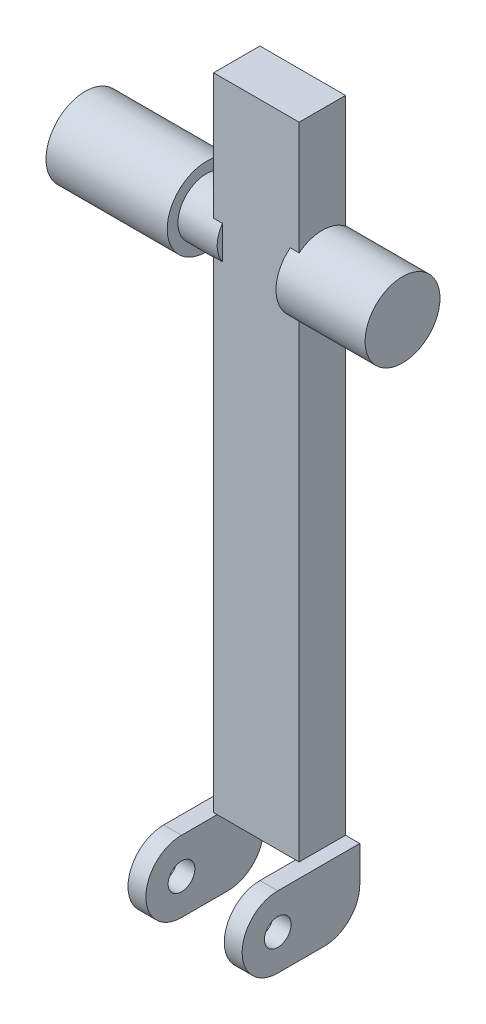
ISO-10303-21;
HEADER;
FILE_DESCRIPTION(('STEP AP214'),'2;1');
FILE_NAME('part.step','',(''),(''),'','','');
FILE_SCHEMA(('AUTOMOTIVE_DESIGN { 1 0 10303 214 1 1 1 1 }'));
ENDSEC;
DATA;
#1=APPLICATION_CONTEXT('core data for automotive mechanical design processes');
#2=APPLICATION_PROTOCOL_DEFINITION('international standard','automotive_design',2000,#1);
#3=PRODUCT_CONTEXT('',#1,'mechanical');
#4=PRODUCT('Part','Part','',(#3));
#5=PRODUCT_RELATED_PRODUCT_CATEGORY('part','',(#4));
#6=PRODUCT_DEFINITION_FORMATION('','',#4);
#7=PRODUCT_DEFINITION_CONTEXT('part definition',#1,'design');
#8=PRODUCT_DEFINITION('design','',#6,#7);
#9=PRODUCT_DEFINITION_SHAPE('','',#8);
#10=(LENGTH_UNIT() NAMED_UNIT(*) SI_UNIT(.MILLI.,.METRE.));
#11=(NAMED_UNIT(*) PLANE_ANGLE_UNIT() SI_UNIT($,.RADIAN.));
#12=(NAMED_UNIT(*) SI_UNIT($,.STERADIAN.) SOLID_ANGLE_UNIT());
#13=UNCERTAINTY_MEASURE_WITH_UNIT(LENGTH_MEASURE(1.E-05),#10,'distance_accuracy_value','');
#14=(GEOMETRIC_REPRESENTATION_CONTEXT(3) GLOBAL_UNCERTAINTY_ASSIGNED_CONTEXT((#13)) GLOBAL_UNIT_ASSIGNED_CONTEXT((#10,
#11,#12)) REPRESENTATION_CONTEXT('',''));
#15=CARTESIAN_POINT('',(0.,0.,0.));
#16=DIRECTION('',(0.,0.,1.));
#17=DIRECTION('',(1.,0.,0.));
#18=AXIS2_PLACEMENT_3D('',#15,#16,#17);
#19=CARTESIAN_POINT('',(22.,-279.4,-13.));
#20=DIRECTION('',(0.,0.,-1.));
#21=DIRECTION('',(-1.,0.,0.));
#22=AXIS2_PLACEMENT_3D('',#19,#20,#21);
#23=PLANE('',#22);
#24=DIRECTION('',(1.,0.,0.));
#25=VECTOR('',#24,1.);
#26=CARTESIAN_POINT('',(22.,-279.4,-13.));
#27=LINE('',#26,#25);
#28=CARTESIAN_POINT('',(22.,-279.4,-13.));
#29=VERTEX_POINT('',#28);
#30=CARTESIAN_POINT('',(32.,-279.4,-13.));
#31=VERTEX_POINT('',#30);
#32=EDGE_CURVE('E46',#29,#31,#27,.T.);
#33=ORIENTED_EDGE('',*,*,#32,.T.);
#34=DIRECTION('',(0.,1.,0.));
#35=VECTOR('',#34,1.);
#36=CARTESIAN_POINT('',(32.,-279.4,-13.));
#37=LINE('',#36,#35);
#38=CARTESIAN_POINT('',(32.,-299.4,-13.));
#39=VERTEX_POINT('',#38);
#40=EDGE_CURVE('E89',#39,#31,#37,.T.);
#41=ORIENTED_EDGE('',*,*,#40,.F.);
#42=DIRECTION('',(1.,0.,0.));
#43=VECTOR('',#42,1.);
#44=CARTESIAN_POINT('',(22.,-299.4,-13.));
#45=LINE('',#44,#43);
#46=CARTESIAN_POINT('',(22.,-299.4,-13.));
#47=VERTEX_POINT('',#46);
#48=EDGE_CURVE('E12',#47,#39,#45,.T.);
#49=ORIENTED_EDGE('',*,*,#48,.F.);
#50=DIRECTION('',(0.,1.,0.));
#51=VECTOR('',#50,1.);
#52=CARTESIAN_POINT('',(22.,-279.4,-13.));
#53=LINE('',#52,#51);
#54=EDGE_CURVE('E90',#47,#29,#53,.T.);
#55=ORIENTED_EDGE('',*,*,#54,.T.);
#56=EDGE_LOOP('',(#33,#41,#49,#55));
#57=FACE_BOUND('',#56,.T.);
#58=ADVANCED_FACE('F43',(#57),#23,.T.);
#59=CARTESIAN_POINT('',(22.,-299.4,6.99999999999999));
#60=DIRECTION('',(1.,0.,0.));
#61=DIRECTION('',(0.,0.,-1.));
#62=AXIS2_PLACEMENT_3D('',#59,#60,#61);
#63=CYLINDRICAL_SURFACE('',#62,20.);
#64=ORIENTED_EDGE('',*,*,#48,.T.);
#65=CARTESIAN_POINT('',(32.,-299.4,6.99999999999999));
#66=DIRECTION('',(1.,0.,0.));
#67=DIRECTION('',(0.,0.,-1.));
#68=AXIS2_PLACEMENT_3D('',#65,#66,#67);
#69=CIRCLE('',#68,20.);
#70=CARTESIAN_POINT('',(32.,-319.4,7.00000000000014));
#71=VERTEX_POINT('',#70);
#72=EDGE_CURVE('E107',#71,#39,#69,.T.);
#73=ORIENTED_EDGE('',*,*,#72,.F.);
#74=DIRECTION('',(1.,0.,0.));
#75=VECTOR('',#74,1.);
#76=CARTESIAN_POINT('',(22.,-319.4,7.00000000000014));
#77=LINE('',#76,#75);
#78=CARTESIAN_POINT('',(22.,-319.4,7.00000000000014));
#79=VERTEX_POINT('',#78);
#80=EDGE_CURVE('E51',#79,#71,#77,.T.);
#81=ORIENTED_EDGE('',*,*,#80,.F.);
#82=CARTESIAN_POINT('',(22.,-299.4,6.99999999999999));
#83=DIRECTION('',(1.,0.,0.));
#84=DIRECTION('',(0.,0.,-1.));
#85=AXIS2_PLACEMENT_3D('',#82,#83,#84);
#86=CIRCLE('',#85,20.);
#87=EDGE_CURVE('E95',#79,#47,#86,.T.);
#88=ORIENTED_EDGE('',*,*,#87,.T.);
#89=EDGE_LOOP('',(#64,#73,#81,#88));
#90=FACE_BOUND('',#89,.T.);
#91=ADVANCED_FACE('F140',(#90),#63,.T.);
#92=CARTESIAN_POINT('',(22.,-319.4,7.00000000000014));
#93=DIRECTION('',(0.,-1.,0.));
#94=DIRECTION('',(0.,0.,-1.));
#95=AXIS2_PLACEMENT_3D('',#92,#93,#94);
#96=PLANE('',#95);
#97=ORIENTED_EDGE('',*,*,#80,.T.);
#98=DIRECTION('',(0.,0.,-1.));
#99=VECTOR('',#98,1.);
#100=CARTESIAN_POINT('',(32.,-319.4,7.00000000000014));
#101=LINE('',#100,#99);
#102=CARTESIAN_POINT('',(32.,-319.4,33.));
#103=VERTEX_POINT('',#102);
#104=EDGE_CURVE('E116',#103,#71,#101,.T.);
#105=ORIENTED_EDGE('',*,*,#104,.F.);
#106=DIRECTION('',(1.,0.,0.));
#107=VECTOR('',#106,1.);
#108=CARTESIAN_POINT('',(22.,-319.4,33.));
#109=LINE('',#108,#107);
#110=CARTESIAN_POINT('',(22.,-319.4,33.));
#111=VERTEX_POINT('',#110);
#112=EDGE_CURVE('E129',#111,#103,#109,.T.);
#113=ORIENTED_EDGE('',*,*,#112,.F.);
#114=DIRECTION('',(0.,0.,-1.));
#115=VECTOR('',#114,1.);
#116=CARTESIAN_POINT('',(22.,-319.4,7.00000000000014));
#117=LINE('',#116,#115);
#118=EDGE_CURVE('E125',#111,#79,#117,.T.);
#119=ORIENTED_EDGE('',*,*,#118,.T.);
#120=EDGE_LOOP('',(#97,#105,#113,#119));
#121=FACE_BOUND('',#120,.T.);
#122=ADVANCED_FACE('F136',(#121),#96,.T.);
#123=CARTESIAN_POINT('',(22.,-299.4,33.));
#124=DIRECTION('',(1.,0.,0.));
#125=DIRECTION('',(0.,0.,-1.));
#126=AXIS2_PLACEMENT_3D('',#123,#124,#125);
#127=CYLINDRICAL_SURFACE('',#126,20.);
#128=ORIENTED_EDGE('',*,*,#112,.T.);
#129=CARTESIAN_POINT('',(32.,-299.4,33.));
#130=DIRECTION('',(1.,0.,0.));
#131=DIRECTION('',(0.,0.,-1.));
#132=AXIS2_PLACEMENT_3D('',#129,#130,#131);
#133=CIRCLE('',#132,20.);
#134=CARTESIAN_POINT('',(32.,-279.4,33.));
#135=VERTEX_POINT('',#134);
#136=EDGE_CURVE('E102',#135,#103,#133,.T.);
#137=ORIENTED_EDGE('',*,*,#136,.F.);
#138=DIRECTION('',(1.,0.,0.));
#139=VECTOR('',#138,1.);
#140=CARTESIAN_POINT('',(22.,-279.4,33.));
#141=LINE('',#140,#139);
#142=CARTESIAN_POINT('',(22.,-279.4,33.));
#143=VERTEX_POINT('',#142);
#144=EDGE_CURVE('E94',#143,#135,#141,.T.);
#145=ORIENTED_EDGE('',*,*,#144,.F.);
#146=CARTESIAN_POINT('',(22.,-299.4,33.));
#147=DIRECTION('',(1.,0.,0.));
#148=DIRECTION('',(0.,0.,-1.));
#149=AXIS2_PLACEMENT_3D('',#146,#147,#148);
#150=CIRCLE('',#149,20.);
#151=EDGE_CURVE('E122',#143,#111,#150,.T.);
#152=ORIENTED_EDGE('',*,*,#151,.T.);
#153=EDGE_LOOP('',(#128,#137,#145,#152));
#154=FACE_BOUND('',#153,.T.);
#155=ADVANCED_FACE('F131',(#154),#127,.T.);
#156=CARTESIAN_POINT('',(22.,-279.4,-13.));
#157=DIRECTION('',(0.,1.,0.));
#158=DIRECTION('',(0.,0.,1.));
#159=AXIS2_PLACEMENT_3D('',#156,#157,#158);
#160=PLANE('',#159);
#161=ORIENTED_EDGE('',*,*,#144,.T.);
#162=DIRECTION('',(0.,0.,1.));
#163=VECTOR('',#162,1.);
#164=CARTESIAN_POINT('',(32.,-279.4,-13.));
#165=LINE('',#164,#163);
#166=EDGE_CURVE('E97',#31,#135,#165,.T.);
#167=ORIENTED_EDGE('',*,*,#166,.F.);
#168=ORIENTED_EDGE('',*,*,#32,.F.);
#169=DIRECTION('',(0.,0.,1.));
#170=VECTOR('',#169,1.);
#171=CARTESIAN_POINT('',(22.,-279.4,-13.));
#172=LINE('',#171,#170);
#173=EDGE_CURVE('E120',#29,#143,#172,.T.);
#174=ORIENTED_EDGE('',*,*,#173,.T.);
#175=EDGE_LOOP('',(#161,#167,#168,#174));
#176=FACE_BOUND('',#175,.T.);
#177=ADVANCED_FACE('F98',(#176),#160,.T.);
#178=CARTESIAN_POINT('',(22.,-299.4,6.99999999999999));
#179=DIRECTION('',(1.,0.,0.));
#180=DIRECTION('',(0.,0.,-1.));
#181=AXIS2_PLACEMENT_3D('',#178,#179,#180);
#182=PLANE('',#181);
#183=CARTESIAN_POINT('',(22.,-299.4,33.));
#184=DIRECTION('',(-1.,0.,0.));
#185=DIRECTION('',(0.,0.,1.));
#186=AXIS2_PLACEMENT_3D('',#183,#184,#185);
#187=CIRCLE('',#186,7.5);
#188=CARTESIAN_POINT('',(22.,-299.4,40.5));
#189=VERTEX_POINT('',#188);
#190=EDGE_CURVE('E111',#189,#189,#187,.T.);
#191=ORIENTED_EDGE('',*,*,#190,.F.);
#192=EDGE_LOOP('',(#191));
#193=FACE_BOUND('',#192,.T.);
#194=ORIENTED_EDGE('',*,*,#54,.F.);
#195=ORIENTED_EDGE('',*,*,#87,.F.);
#196=ORIENTED_EDGE('',*,*,#118,.F.);
#197=ORIENTED_EDGE('',*,*,#151,.F.);
#198=ORIENTED_EDGE('',*,*,#173,.F.);
#199=EDGE_LOOP('',(#194,#195,#196,#197,#198));
#200=FACE_BOUND('',#199,.T.);
#201=ADVANCED_FACE('F139',(#193,#200),#182,.F.);
#202=CARTESIAN_POINT('',(32.,-299.4,6.99999999999999));
#203=DIRECTION('',(1.,0.,0.));
#204=DIRECTION('',(0.,0.,-1.));
#205=AXIS2_PLACEMENT_3D('',#202,#203,#204);
#206=PLANE('',#205);
#207=CARTESIAN_POINT('',(32.,-299.4,33.));
#208=DIRECTION('',(-1.,0.,0.));
#209=DIRECTION('',(0.,0.,1.));
#210=AXIS2_PLACEMENT_3D('',#207,#208,#209);
#211=CIRCLE('',#210,7.5);
#212=CARTESIAN_POINT('',(32.,-299.4,40.5));
#213=VERTEX_POINT('',#212);
#214=EDGE_CURVE('E108',#213,#213,#211,.T.);
#215=ORIENTED_EDGE('',*,*,#214,.T.);
#216=EDGE_LOOP('',(#215));
#217=FACE_BOUND('',#216,.T.);
#218=ORIENTED_EDGE('',*,*,#40,.T.);
#219=ORIENTED_EDGE('',*,*,#166,.T.);
#220=ORIENTED_EDGE('',*,*,#136,.T.);
#221=ORIENTED_EDGE('',*,*,#104,.T.);
#222=ORIENTED_EDGE('',*,*,#72,.T.);
#223=EDGE_LOOP('',(#218,#219,#220,#221,#222));
#224=FACE_BOUND('',#223,.T.);
#225=ADVANCED_FACE('F105',(#217,#224),#206,.T.);
#226=CARTESIAN_POINT('',(32.,-299.4,33.));
#227=DIRECTION('',(-1.,0.,0.));
#228=DIRECTION('',(0.,0.,1.));
#229=AXIS2_PLACEMENT_3D('',#226,#227,#228);
#230=CYLINDRICAL_SURFACE('',#229,7.5);
#231=ORIENTED_EDGE('',*,*,#214,.F.);
#232=EDGE_LOOP('',(#231));
#233=FACE_BOUND('',#232,.T.);
#234=ORIENTED_EDGE('',*,*,#190,.T.);
#235=EDGE_LOOP('',(#234));
#236=FACE_BOUND('',#235,.T.);
#237=ADVANCED_FACE('F160',(#233,#236),#230,.F.);
#238=CLOSED_SHELL('',(#58,#91,#122,#155,#177,#201,#225,#237));
#239=MANIFOLD_SOLID_BREP('B2',#238);
#240=CARTESIAN_POINT('',(0.,-279.4,0.));
#241=DIRECTION('',(0.,1.,0.));
#242=DIRECTION('',(0.,0.,1.));
#243=AXIS2_PLACEMENT_3D('',#240,#241,#242);
#244=PLANE('',#243);
#245=DIRECTION('',(0.,0.,1.));
#246=VECTOR('',#245,1.);
#247=CARTESIAN_POINT('',(-22.,-279.4,-13.));
#248=LINE('',#247,#246);
#249=CARTESIAN_POINT('',(-22.,-279.4,-13.));
#250=VERTEX_POINT('',#249);
#251=CARTESIAN_POINT('',(-22.,-279.4,13.));
#252=VERTEX_POINT('',#251);
#253=EDGE_CURVE('E229',#250,#252,#248,.T.);
#254=ORIENTED_EDGE('',*,*,#253,.F.);
#255=DIRECTION('',(-1.,0.,0.));
#256=VECTOR('',#255,1.);
#257=CARTESIAN_POINT('',(-24.,-279.4,-13.));
#258=LINE('',#257,#256);
#259=CARTESIAN_POINT('',(24.,-279.4,-13.));
#260=VERTEX_POINT('',#259);
#261=EDGE_CURVE('E433',#260,#250,#258,.T.);
#262=ORIENTED_EDGE('',*,*,#261,.F.);
#263=DIRECTION('',(0.,0.,-1.));
#264=VECTOR('',#263,1.);
#265=CARTESIAN_POINT('',(24.,-279.4,-13.));
#266=LINE('',#265,#264);
#267=CARTESIAN_POINT('',(24.,-279.4,13.));
#268=VERTEX_POINT('',#267);
#269=EDGE_CURVE('E430',#268,#260,#266,.T.);
#270=ORIENTED_EDGE('',*,*,#269,.F.);
#271=DIRECTION('',(1.,0.,0.));
#272=VECTOR('',#271,1.);
#273=CARTESIAN_POINT('',(-24.,-279.4,13.));
#274=LINE('',#273,#272);
#275=EDGE_CURVE('E436',#252,#268,#274,.T.);
#276=ORIENTED_EDGE('',*,*,#275,.F.);
#277=EDGE_LOOP('',(#254,#262,#270,#276));
#278=FACE_BOUND('',#277,.T.);
#279=ADVANCED_FACE('F214',(#278),#244,.F.);
#280=CARTESIAN_POINT('',(24.,-279.4,-13.));
#281=DIRECTION('',(1.,0.,0.));
#282=DIRECTION('',(0.,0.,-1.));
#283=AXIS2_PLACEMENT_3D('',#280,#281,#282);
#284=PLANE('',#283);
#285=DIRECTION('',(0.,1.,0.));
#286=VECTOR('',#285,1.);
#287=CARTESIAN_POINT('',(24.,-279.4,-13.));
#288=LINE('',#287,#286);
#289=CARTESIAN_POINT('',(24.,-16.4924225024707,-13.));
#290=VERTEX_POINT('',#289);
#291=EDGE_CURVE('E452',#260,#290,#288,.T.);
#292=ORIENTED_EDGE('',*,*,#291,.T.);
#293=CARTESIAN_POINT('',(24.,0.,0.));
#294=DIRECTION('',(1.,0.,0.));
#295=DIRECTION('',(0.,0.,-1.));
#296=AXIS2_PLACEMENT_3D('',#293,#294,#295);
#297=CIRCLE('',#296,21.);
#298=CARTESIAN_POINT('',(24.,-16.4924225024706,13.));
#299=VERTEX_POINT('',#298);
#300=EDGE_CURVE('E412',#290,#299,#297,.F.);
#301=ORIENTED_EDGE('',*,*,#300,.T.);
#302=DIRECTION('',(0.,1.,0.));
#303=VECTOR('',#302,1.);
#304=CARTESIAN_POINT('',(24.,-279.4,13.));
#305=LINE('',#304,#303);
#306=EDGE_CURVE('E440',#268,#299,#305,.T.);
#307=ORIENTED_EDGE('',*,*,#306,.F.);
#308=ORIENTED_EDGE('',*,*,#269,.T.);
#309=EDGE_LOOP('',(#292,#301,#307,#308));
#310=FACE_BOUND('',#309,.T.);
#311=ADVANCED_FACE('F529',(#310),#284,.T.);
#312=CARTESIAN_POINT('',(24.,16.4924225024706,13.));
#313=VERTEX_POINT('',#312);
#314=CARTESIAN_POINT('',(24.,80.,13.));
#315=VERTEX_POINT('',#314);
#316=EDGE_CURVE('E444',#313,#315,#305,.T.);
#317=ORIENTED_EDGE('',*,*,#316,.F.);
#318=CARTESIAN_POINT('',(24.,16.4924225024707,-13.));
#319=VERTEX_POINT('',#318);
#320=EDGE_CURVE('E408',#313,#319,#297,.F.);
#321=ORIENTED_EDGE('',*,*,#320,.T.);
#322=CARTESIAN_POINT('',(24.,80.,-13.));
#323=VERTEX_POINT('',#322);
#324=EDGE_CURVE('E439',#319,#323,#288,.T.);
#325=ORIENTED_EDGE('',*,*,#324,.T.);
#326=DIRECTION('',(0.,0.,-1.));
#327=VECTOR('',#326,1.);
#328=CARTESIAN_POINT('',(24.,80.,-13.));
#329=LINE('',#328,#327);
#330=EDGE_CURVE('E418',#315,#323,#329,.T.);
#331=ORIENTED_EDGE('',*,*,#330,.F.);
#332=EDGE_LOOP('',(#317,#321,#325,#331));
#333=FACE_BOUND('',#332,.T.);
#334=ADVANCED_FACE('F497',(#333),#284,.T.);
#335=CARTESIAN_POINT('',(-24.,-279.4,13.));
#336=DIRECTION('',(0.,0.,1.));
#337=DIRECTION('',(1.,0.,0.));
#338=AXIS2_PLACEMENT_3D('',#335,#336,#337);
#339=PLANE('',#338);
#340=DIRECTION('',(0.,1.,0.));
#341=VECTOR('',#340,1.);
#342=CARTESIAN_POINT('',(19.,-279.4,13.));
#343=LINE('',#342,#341);
#344=CARTESIAN_POINT('',(19.,-16.4924225024706,13.));
#345=VERTEX_POINT('',#344);
#346=CARTESIAN_POINT('',(19.,16.4924225024706,13.));
#347=VERTEX_POINT('',#346);
#348=EDGE_CURVE('E403',#345,#347,#343,.T.);
#349=ORIENTED_EDGE('',*,*,#348,.T.);
#350=DIRECTION('',(-1.,0.,0.));
#351=VECTOR('',#350,1.);
#352=CARTESIAN_POINT('',(69.,16.4924225024706,13.));
#353=LINE('',#352,#351);
#354=EDGE_CURVE('E411',#347,#313,#353,.F.);
#355=ORIENTED_EDGE('',*,*,#354,.T.);
#356=ORIENTED_EDGE('',*,*,#316,.T.);
#357=DIRECTION('',(1.,0.,0.));
#358=VECTOR('',#357,1.);
#359=CARTESIAN_POINT('',(-24.,80.,13.));
#360=LINE('',#359,#358);
#361=CARTESIAN_POINT('',(-24.,80.,13.));
#362=VERTEX_POINT('',#361);
#363=EDGE_CURVE('E427',#362,#315,#360,.T.);
#364=ORIENTED_EDGE('',*,*,#363,.F.);
#365=DIRECTION('',(0.,1.,0.));
#366=VECTOR('',#365,1.);
#367=CARTESIAN_POINT('',(-24.,-279.4,13.));
#368=LINE('',#367,#366);
#369=CARTESIAN_POINT('',(-24.,9.3273790530888,13.));
#370=VERTEX_POINT('',#369);
#371=EDGE_CURVE('E448',#370,#362,#368,.T.);
#372=ORIENTED_EDGE('',*,*,#371,.F.);
#373=DIRECTION('',(1.,0.,0.));
#374=VECTOR('',#373,1.);
#375=CARTESIAN_POINT('',(-41.,9.3273790530888,13.));
#376=LINE('',#375,#374);
#377=CARTESIAN_POINT('',(-19.,9.3273790530888,13.));
#378=VERTEX_POINT('',#377);
#379=EDGE_CURVE('E460',#370,#378,#376,.T.);
#380=ORIENTED_EDGE('',*,*,#379,.T.);
#381=DIRECTION('',(0.,-1.,0.));
#382=VECTOR('',#381,1.);
#383=CARTESIAN_POINT('',(-19.,0.,13.));
#384=LINE('',#383,#382);
#385=CARTESIAN_POINT('',(-19.,-9.3273790530888,13.));
#386=VERTEX_POINT('',#385);
#387=EDGE_CURVE('E481',#378,#386,#384,.T.);
#388=ORIENTED_EDGE('',*,*,#387,.T.);
#389=DIRECTION('',(1.,0.,0.));
#390=VECTOR('',#389,1.);
#391=CARTESIAN_POINT('',(-41.,-9.3273790530888,13.));
#392=LINE('',#391,#390);
#393=CARTESIAN_POINT('',(-24.,-9.3273790530888,13.));
#394=VERTEX_POINT('',#393);
#395=EDGE_CURVE('E463',#386,#394,#392,.F.);
#396=ORIENTED_EDGE('',*,*,#395,.T.);
#397=CARTESIAN_POINT('',(-24.,-279.4,13.));
#398=VERTEX_POINT('',#397);
#399=EDGE_CURVE('E445',#398,#394,#368,.T.);
#400=ORIENTED_EDGE('',*,*,#399,.F.);
#401=EDGE_CURVE('E437',#398,#252,#274,.T.);
#402=ORIENTED_EDGE('',*,*,#401,.T.);
#403=ORIENTED_EDGE('',*,*,#275,.T.);
#404=ORIENTED_EDGE('',*,*,#306,.T.);
#405=DIRECTION('',(-1.,0.,0.));
#406=VECTOR('',#405,1.);
#407=CARTESIAN_POINT('',(69.,-16.4924225024706,13.));
#408=LINE('',#407,#406);
#409=EDGE_CURVE('E415',#299,#345,#408,.T.);
#410=ORIENTED_EDGE('',*,*,#409,.T.);
#411=EDGE_LOOP('',(#349,#355,#356,#364,#372,#380,#388,#396,#400,#402,#403,#404,#410));
#412=FACE_BOUND('',#411,.T.);
#413=ADVANCED_FACE('F501',(#412),#339,.T.);
#414=CARTESIAN_POINT('',(-24.,-279.4,-13.));
#415=DIRECTION('',(0.,0.,-1.));
#416=DIRECTION('',(-1.,0.,0.));
#417=AXIS2_PLACEMENT_3D('',#414,#415,#416);
#418=PLANE('',#417);
#419=DIRECTION('',(0.,-1.,0.));
#420=VECTOR('',#419,1.);
#421=CARTESIAN_POINT('',(19.,-279.4,-13.));
#422=LINE('',#421,#420);
#423=CARTESIAN_POINT('',(19.,16.4924225024707,-13.));
#424=VERTEX_POINT('',#423);
#425=CARTESIAN_POINT('',(19.,-16.4924225024707,-13.));
#426=VERTEX_POINT('',#425);
#427=EDGE_CURVE('E488',#424,#426,#422,.T.);
#428=ORIENTED_EDGE('',*,*,#427,.T.);
#429=DIRECTION('',(-1.,0.,0.));
#430=VECTOR('',#429,1.);
#431=CARTESIAN_POINT('',(69.,-16.4924225024707,-13.));
#432=LINE('',#431,#430);
#433=EDGE_CURVE('E41',#426,#290,#432,.F.);
#434=ORIENTED_EDGE('',*,*,#433,.T.);
#435=ORIENTED_EDGE('',*,*,#291,.F.);
#436=ORIENTED_EDGE('',*,*,#261,.T.);
#437=DIRECTION('',(0.,1.,0.));
#438=VECTOR('',#437,1.);
#439=CARTESIAN_POINT('',(-22.,-279.4,-13.));
#440=LINE('',#439,#438);
#441=CARTESIAN_POINT('',(-22.,-299.4,-13.));
#442=VERTEX_POINT('',#441);
#443=EDGE_CURVE('E370',#442,#250,#440,.T.);
#444=ORIENTED_EDGE('',*,*,#443,.F.);
#445=DIRECTION('',(-1.,0.,0.));
#446=VECTOR('',#445,1.);
#447=CARTESIAN_POINT('',(-22.,-299.4,-13.));
#448=LINE('',#447,#446);
#449=CARTESIAN_POINT('',(-32.,-299.4,-13.));
#450=VERTEX_POINT('',#449);
#451=EDGE_CURVE('E368',#442,#450,#448,.T.);
#452=ORIENTED_EDGE('',*,*,#451,.T.);
#453=DIRECTION('',(0.,1.,0.));
#454=VECTOR('',#453,1.);
#455=CARTESIAN_POINT('',(-32.,-279.4,-13.));
#456=LINE('',#455,#454);
#457=CARTESIAN_POINT('',(-32.,-279.4,-13.));
#458=VERTEX_POINT('',#457);
#459=EDGE_CURVE('E351',#450,#458,#456,.T.);
#460=ORIENTED_EDGE('',*,*,#459,.T.);
#461=DIRECTION('',(-1.,0.,0.));
#462=VECTOR('',#461,1.);
#463=CARTESIAN_POINT('',(-22.,-279.4,-13.));
#464=LINE('',#463,#462);
#465=CARTESIAN_POINT('',(-24.,-279.4,-13.));
#466=VERTEX_POINT('',#465);
#467=EDGE_CURVE('E338',#466,#458,#464,.T.);
#468=ORIENTED_EDGE('',*,*,#467,.F.);
#469=DIRECTION('',(0.,1.,0.));
#470=VECTOR('',#469,1.);
#471=CARTESIAN_POINT('',(-24.,-279.4,-13.));
#472=LINE('',#471,#470);
#473=CARTESIAN_POINT('',(-24.,-9.32737905308883,-13.));
#474=VERTEX_POINT('',#473);
#475=EDGE_CURVE('E449',#466,#474,#472,.T.);
#476=ORIENTED_EDGE('',*,*,#475,.T.);
#477=DIRECTION('',(1.,0.,0.));
#478=VECTOR('',#477,1.);
#479=CARTESIAN_POINT('',(-41.,-9.32737905308883,-13.));
#480=LINE('',#479,#478);
#481=CARTESIAN_POINT('',(-19.,-9.32737905308883,-13.));
#482=VERTEX_POINT('',#481);
#483=EDGE_CURVE('E443',#474,#482,#480,.T.);
#484=ORIENTED_EDGE('',*,*,#483,.T.);
#485=DIRECTION('',(0.,1.,0.));
#486=VECTOR('',#485,1.);
#487=CARTESIAN_POINT('',(-19.,0.,-13.));
#488=LINE('',#487,#486);
#489=CARTESIAN_POINT('',(-19.,9.32737905308883,-13.));
#490=VERTEX_POINT('',#489);
#491=EDGE_CURVE('E478',#482,#490,#488,.T.);
#492=ORIENTED_EDGE('',*,*,#491,.T.);
#493=DIRECTION('',(1.,0.,0.));
#494=VECTOR('',#493,1.);
#495=CARTESIAN_POINT('',(-41.,9.32737905308883,-13.));
#496=LINE('',#495,#494);
#497=CARTESIAN_POINT('',(-24.,9.32737905308883,-13.));
#498=VERTEX_POINT('',#497);
#499=EDGE_CURVE('E457',#490,#498,#496,.F.);
#500=ORIENTED_EDGE('',*,*,#499,.T.);
#501=CARTESIAN_POINT('',(-24.,80.,-13.));
#502=VERTEX_POINT('',#501);
#503=EDGE_CURVE('E451',#498,#502,#472,.T.);
#504=ORIENTED_EDGE('',*,*,#503,.T.);
#505=DIRECTION('',(-1.,0.,0.));
#506=VECTOR('',#505,1.);
#507=CARTESIAN_POINT('',(-24.,80.,-13.));
#508=LINE('',#507,#506);
#509=EDGE_CURVE('E421',#323,#502,#508,.T.);
#510=ORIENTED_EDGE('',*,*,#509,.F.);
#511=ORIENTED_EDGE('',*,*,#324,.F.);
#512=DIRECTION('',(-1.,0.,0.));
#513=VECTOR('',#512,1.);
#514=CARTESIAN_POINT('',(69.,16.4924225024707,-13.));
#515=LINE('',#514,#513);
#516=EDGE_CURVE('E222',#319,#424,#515,.T.);
#517=ORIENTED_EDGE('',*,*,#516,.T.);
#518=EDGE_LOOP('',(#428,#434,#435,#436,#444,#452,#460,#468,#476,#484,#492,#500,#504,#510,#511,#517));
#519=FACE_BOUND('',#518,.T.);
#520=ADVANCED_FACE('F365',(#519),#418,.T.);
#521=CARTESIAN_POINT('',(-19.,0.,0.));
#522=DIRECTION('',(1.,0.,0.));
#523=DIRECTION('',(0.,0.,-1.));
#524=AXIS2_PLACEMENT_3D('',#521,#522,#523);
#525=PLANE('',#524);
#526=ORIENTED_EDGE('',*,*,#387,.F.);
#527=CARTESIAN_POINT('',(-19.,0.,0.));
#528=DIRECTION('',(1.,0.,0.));
#529=DIRECTION('',(0.,0.,-1.));
#530=AXIS2_PLACEMENT_3D('',#527,#528,#529);
#531=CIRCLE('',#530,16.);
#532=EDGE_CURVE('E477',#378,#386,#531,.T.);
#533=ORIENTED_EDGE('',*,*,#532,.T.);
#534=EDGE_LOOP('',(#526,#533));
#535=FACE_BOUND('',#534,.T.);
#536=ADVANCED_FACE('F516',(#535),#525,.T.);
#537=CARTESIAN_POINT('',(-41.,0.,0.));
#538=DIRECTION('',(1.,0.,0.));
#539=DIRECTION('',(0.,0.,-1.));
#540=AXIS2_PLACEMENT_3D('',#537,#538,#539);
#541=CYLINDRICAL_SURFACE('',#540,16.);
#542=ORIENTED_EDGE('',*,*,#379,.F.);
#543=CARTESIAN_POINT('',(-24.,0.,0.));
#544=DIRECTION('',(-1.,0.,0.));
#545=DIRECTION('',(0.,0.,1.));
#546=AXIS2_PLACEMENT_3D('',#543,#544,#545);
#547=CIRCLE('',#546,16.);
#548=EDGE_CURVE('E487',#498,#370,#547,.F.);
#549=ORIENTED_EDGE('',*,*,#548,.F.);
#550=ORIENTED_EDGE('',*,*,#499,.F.);
#551=EDGE_CURVE('E475',#482,#490,#531,.T.);
#552=ORIENTED_EDGE('',*,*,#551,.F.);
#553=ORIENTED_EDGE('',*,*,#483,.F.);
#554=EDGE_CURVE('E484',#394,#474,#547,.F.);
#555=ORIENTED_EDGE('',*,*,#554,.F.);
#556=ORIENTED_EDGE('',*,*,#395,.F.);
#557=ORIENTED_EDGE('',*,*,#532,.F.);
#558=EDGE_LOOP('',(#542,#549,#550,#552,#553,#555,#556,#557));
#559=FACE_BOUND('',#558,.T.);
#560=CARTESIAN_POINT('',(-41.,0.,0.));
#561=DIRECTION('',(-1.,0.,0.));
#562=DIRECTION('',(0.,0.,1.));
#563=AXIS2_PLACEMENT_3D('',#560,#561,#562);
#564=CIRCLE('',#563,16.);
#565=CARTESIAN_POINT('',(-41.,0.,16.));
#566=VERTEX_POINT('',#565);
#567=EDGE_CURVE('E470',#566,#566,#564,.F.);
#568=ORIENTED_EDGE('',*,*,#567,.T.);
#569=EDGE_LOOP('',(#568));
#570=FACE_BOUND('',#569,.T.);
#571=ADVANCED_FACE('F216',(#559,#570),#541,.T.);
#572=ORIENTED_EDGE('',*,*,#491,.F.);
#573=ORIENTED_EDGE('',*,*,#551,.T.);
#574=EDGE_LOOP('',(#572,#573));
#575=FACE_BOUND('',#574,.T.);
#576=ADVANCED_FACE('F518',(#575),#525,.T.);
#577=CARTESIAN_POINT('',(-109.,0.,0.));
#578=DIRECTION('',(1.,0.,0.));
#579=DIRECTION('',(0.,0.,-1.));
#580=AXIS2_PLACEMENT_3D('',#577,#578,#579);
#581=CYLINDRICAL_SURFACE('',#580,22.);
#582=CARTESIAN_POINT('',(-109.,0.,0.));
#583=DIRECTION('',(-1.,0.,0.));
#584=DIRECTION('',(0.,0.,1.));
#585=AXIS2_PLACEMENT_3D('',#582,#583,#584);
#586=CIRCLE('',#585,22.);
#587=CARTESIAN_POINT('',(-109.,0.,22.));
#588=VERTEX_POINT('',#587);
#589=EDGE_CURVE('E467',#588,#588,#586,.T.);
#590=ORIENTED_EDGE('',*,*,#589,.F.);
#591=EDGE_LOOP('',(#590));
#592=FACE_BOUND('',#591,.T.);
#593=CARTESIAN_POINT('',(-41.,0.,0.));
#594=DIRECTION('',(-1.,0.,0.));
#595=DIRECTION('',(0.,0.,1.));
#596=AXIS2_PLACEMENT_3D('',#593,#594,#595);
#597=CIRCLE('',#596,22.);
#598=CARTESIAN_POINT('',(-41.,0.,22.));
#599=VERTEX_POINT('',#598);
#600=EDGE_CURVE('E466',#599,#599,#597,.T.);
#601=ORIENTED_EDGE('',*,*,#600,.T.);
#602=EDGE_LOOP('',(#601));
#603=FACE_BOUND('',#602,.T.);
#604=ADVANCED_FACE('F526',(#592,#603),#581,.T.);
#605=CARTESIAN_POINT('',(-109.,0.,0.));
#606=DIRECTION('',(-1.,0.,0.));
#607=DIRECTION('',(0.,0.,1.));
#608=AXIS2_PLACEMENT_3D('',#605,#606,#607);
#609=PLANE('',#608);
#610=ORIENTED_EDGE('',*,*,#589,.T.);
#611=EDGE_LOOP('',(#610));
#612=FACE_BOUND('',#611,.T.);
#613=ADVANCED_FACE('F544',(#612),#609,.T.);
#614=CARTESIAN_POINT('',(-41.,0.,0.));
#615=DIRECTION('',(-1.,0.,0.));
#616=DIRECTION('',(0.,0.,1.));
#617=AXIS2_PLACEMENT_3D('',#614,#615,#616);
#618=PLANE('',#617);
#619=ORIENTED_EDGE('',*,*,#567,.F.);
#620=EDGE_LOOP('',(#619));
#621=FACE_BOUND('',#620,.T.);
#622=ORIENTED_EDGE('',*,*,#600,.F.);
#623=EDGE_LOOP('',(#622));
#624=FACE_BOUND('',#623,.T.);
#625=ADVANCED_FACE('F547',(#621,#624),#618,.F.);
#626=CARTESIAN_POINT('',(-24.,-279.4,-13.));
#627=DIRECTION('',(-1.,0.,0.));
#628=DIRECTION('',(0.,0.,1.));
#629=AXIS2_PLACEMENT_3D('',#626,#627,#628);
#630=PLANE('',#629);
#631=ORIENTED_EDGE('',*,*,#399,.T.);
#632=ORIENTED_EDGE('',*,*,#554,.T.);
#633=ORIENTED_EDGE('',*,*,#475,.F.);
#634=DIRECTION('',(0.,0.,1.));
#635=VECTOR('',#634,1.);
#636=CARTESIAN_POINT('',(-24.,-279.4,-13.));
#637=LINE('',#636,#635);
#638=EDGE_CURVE('E347',#466,#398,#637,.T.);
#639=ORIENTED_EDGE('',*,*,#638,.T.);
#640=EDGE_LOOP('',(#631,#632,#633,#639));
#641=FACE_BOUND('',#640,.T.);
#642=ADVANCED_FACE('F542',(#641),#630,.T.);
#643=ORIENTED_EDGE('',*,*,#503,.F.);
#644=ORIENTED_EDGE('',*,*,#548,.T.);
#645=ORIENTED_EDGE('',*,*,#371,.T.);
#646=DIRECTION('',(0.,0.,1.));
#647=VECTOR('',#646,1.);
#648=CARTESIAN_POINT('',(-24.,80.,-13.));
#649=LINE('',#648,#647);
#650=EDGE_CURVE('E424',#502,#362,#649,.T.);
#651=ORIENTED_EDGE('',*,*,#650,.F.);
#652=EDGE_LOOP('',(#643,#644,#645,#651));
#653=FACE_BOUND('',#652,.T.);
#654=ADVANCED_FACE('F508',(#653),#630,.T.);
#655=CARTESIAN_POINT('',(0.,80.,0.));
#656=DIRECTION('',(0.,1.,0.));
#657=DIRECTION('',(0.,0.,1.));
#658=AXIS2_PLACEMENT_3D('',#655,#656,#657);
#659=PLANE('',#658);
#660=ORIENTED_EDGE('',*,*,#330,.T.);
#661=ORIENTED_EDGE('',*,*,#509,.T.);
#662=ORIENTED_EDGE('',*,*,#650,.T.);
#663=ORIENTED_EDGE('',*,*,#363,.T.);
#664=EDGE_LOOP('',(#660,#661,#662,#663));
#665=FACE_BOUND('',#664,.T.);
#666=ADVANCED_FACE('F504',(#665),#659,.T.);
#667=CARTESIAN_POINT('',(19.,0.,0.));
#668=DIRECTION('',(1.,0.,0.));
#669=DIRECTION('',(0.,0.,-1.));
#670=AXIS2_PLACEMENT_3D('',#667,#668,#669);
#671=PLANE('',#670);
#672=ORIENTED_EDGE('',*,*,#348,.F.);
#673=CARTESIAN_POINT('',(19.,0.,0.));
#674=DIRECTION('',(1.,0.,0.));
#675=DIRECTION('',(0.,0.,-1.));
#676=AXIS2_PLACEMENT_3D('',#673,#674,#675);
#677=CIRCLE('',#676,21.);
#678=EDGE_CURVE('E404',#347,#345,#677,.T.);
#679=ORIENTED_EDGE('',*,*,#678,.F.);
#680=EDGE_LOOP('',(#672,#679));
#681=FACE_BOUND('',#680,.T.);
#682=ADVANCED_FACE('F588',(#681),#671,.F.);
#683=CARTESIAN_POINT('',(69.,0.,0.));
#684=DIRECTION('',(-1.,0.,0.));
#685=DIRECTION('',(0.,0.,1.));
#686=AXIS2_PLACEMENT_3D('',#683,#684,#685);
#687=CYLINDRICAL_SURFACE('',#686,21.);
#688=ORIENTED_EDGE('',*,*,#409,.F.);
#689=ORIENTED_EDGE('',*,*,#300,.F.);
#690=ORIENTED_EDGE('',*,*,#433,.F.);
#691=EDGE_CURVE('E236',#426,#424,#677,.T.);
#692=ORIENTED_EDGE('',*,*,#691,.T.);
#693=ORIENTED_EDGE('',*,*,#516,.F.);
#694=ORIENTED_EDGE('',*,*,#320,.F.);
#695=ORIENTED_EDGE('',*,*,#354,.F.);
#696=ORIENTED_EDGE('',*,*,#678,.T.);
#697=EDGE_LOOP('',(#688,#689,#690,#692,#693,#694,#695,#696));
#698=FACE_BOUND('',#697,.T.);
#699=CARTESIAN_POINT('',(69.,0.,0.));
#700=DIRECTION('',(1.,0.,0.));
#701=DIRECTION('',(0.,0.,-1.));
#702=AXIS2_PLACEMENT_3D('',#699,#700,#701);
#703=CIRCLE('',#702,21.);
#704=CARTESIAN_POINT('',(69.,0.,-21.));
#705=VERTEX_POINT('',#704);
#706=EDGE_CURVE('E400',#705,#705,#703,.T.);
#707=ORIENTED_EDGE('',*,*,#706,.F.);
#708=EDGE_LOOP('',(#707));
#709=FACE_BOUND('',#708,.T.);
#710=ADVANCED_FACE('F493',(#698,#709),#687,.T.);
#711=CARTESIAN_POINT('',(69.,0.,0.));
#712=DIRECTION('',(1.,0.,0.));
#713=DIRECTION('',(0.,0.,-1.));
#714=AXIS2_PLACEMENT_3D('',#711,#712,#713);
#715=PLANE('',#714);
#716=ORIENTED_EDGE('',*,*,#706,.T.);
#717=EDGE_LOOP('',(#716));
#718=FACE_BOUND('',#717,.T.);
#719=ADVANCED_FACE('F602',(#718),#715,.T.);
#720=ORIENTED_EDGE('',*,*,#427,.F.);
#721=ORIENTED_EDGE('',*,*,#691,.F.);
#722=EDGE_LOOP('',(#720,#721));
#723=FACE_BOUND('',#722,.T.);
#724=ADVANCED_FACE('F596',(#723),#671,.F.);
#725=CARTESIAN_POINT('',(-22.,-299.4,6.99999999999999));
#726=DIRECTION('',(-1.,0.,0.));
#727=DIRECTION('',(0.,0.,-1.));
#728=AXIS2_PLACEMENT_3D('',#725,#726,#727);
#729=CYLINDRICAL_SURFACE('',#728,20.);
#730=ORIENTED_EDGE('',*,*,#451,.F.);
#731=CARTESIAN_POINT('',(-22.,-299.4,6.99999999999999));
#732=DIRECTION('',(1.,0.,0.));
#733=DIRECTION('',(0.,0.,-1.));
#734=AXIS2_PLACEMENT_3D('',#731,#732,#733);
#735=CIRCLE('',#734,20.);
#736=CARTESIAN_POINT('',(-22.,-319.4,7.00000000000014));
#737=VERTEX_POINT('',#736);
#738=EDGE_CURVE('E380',#737,#442,#735,.T.);
#739=ORIENTED_EDGE('',*,*,#738,.F.);
#740=DIRECTION('',(-1.,0.,0.));
#741=VECTOR('',#740,1.);
#742=CARTESIAN_POINT('',(-22.,-319.4,7.00000000000014));
#743=LINE('',#742,#741);
#744=CARTESIAN_POINT('',(-32.,-319.4,7.00000000000014));
#745=VERTEX_POINT('',#744);
#746=EDGE_CURVE('E377',#737,#745,#743,.T.);
#747=ORIENTED_EDGE('',*,*,#746,.T.);
#748=CARTESIAN_POINT('',(-32.,-299.4,6.99999999999999));
#749=DIRECTION('',(1.,0.,0.));
#750=DIRECTION('',(0.,0.,-1.));
#751=AXIS2_PLACEMENT_3D('',#748,#749,#750);
#752=CIRCLE('',#751,20.);
#753=EDGE_CURVE('E375',#745,#450,#752,.T.);
#754=ORIENTED_EDGE('',*,*,#753,.T.);
#755=EDGE_LOOP('',(#730,#739,#747,#754));
#756=FACE_BOUND('',#755,.T.);
#757=ADVANCED_FACE('F615',(#756),#729,.T.);
#758=CARTESIAN_POINT('',(-22.,-319.4,7.00000000000014));
#759=DIRECTION('',(0.,-1.,0.));
#760=DIRECTION('',(0.,0.,-1.));
#761=AXIS2_PLACEMENT_3D('',#758,#759,#760);
#762=PLANE('',#761);
#763=ORIENTED_EDGE('',*,*,#746,.F.);
#764=DIRECTION('',(0.,0.,-1.));
#765=VECTOR('',#764,1.);
#766=CARTESIAN_POINT('',(-22.,-319.4,7.00000000000014));
#767=LINE('',#766,#765);
#768=CARTESIAN_POINT('',(-22.,-319.4,33.));
#769=VERTEX_POINT('',#768);
#770=EDGE_CURVE('E387',#769,#737,#767,.T.);
#771=ORIENTED_EDGE('',*,*,#770,.F.);
#772=DIRECTION('',(-1.,0.,0.));
#773=VECTOR('',#772,1.);
#774=CARTESIAN_POINT('',(-22.,-319.4,33.));
#775=LINE('',#774,#773);
#776=CARTESIAN_POINT('',(-32.,-319.4,33.));
#777=VERTEX_POINT('',#776);
#778=EDGE_CURVE('E384',#769,#777,#775,.T.);
#779=ORIENTED_EDGE('',*,*,#778,.T.);
#780=DIRECTION('',(0.,0.,-1.));
#781=VECTOR('',#780,1.);
#782=CARTESIAN_POINT('',(-32.,-319.4,7.00000000000014));
#783=LINE('',#782,#781);
#784=EDGE_CURVE('E382',#777,#745,#783,.T.);
#785=ORIENTED_EDGE('',*,*,#784,.T.);
#786=EDGE_LOOP('',(#763,#771,#779,#785));
#787=FACE_BOUND('',#786,.T.);
#788=ADVANCED_FACE('F620',(#787),#762,.T.);
#789=CARTESIAN_POINT('',(-22.,-299.4,33.));
#790=DIRECTION('',(-1.,0.,0.));
#791=DIRECTION('',(0.,0.,-1.));
#792=AXIS2_PLACEMENT_3D('',#789,#790,#791);
#793=CYLINDRICAL_SURFACE('',#792,20.);
#794=ORIENTED_EDGE('',*,*,#778,.F.);
#795=CARTESIAN_POINT('',(-22.,-299.4,33.));
#796=DIRECTION('',(1.,0.,0.));
#797=DIRECTION('',(0.,0.,-1.));
#798=AXIS2_PLACEMENT_3D('',#795,#796,#797);
#799=CIRCLE('',#798,20.);
#800=CARTESIAN_POINT('',(-22.,-279.4,33.));
#801=VERTEX_POINT('',#800);
#802=EDGE_CURVE('E362',#801,#769,#799,.T.);
#803=ORIENTED_EDGE('',*,*,#802,.F.);
#804=DIRECTION('',(-1.,0.,0.));
#805=VECTOR('',#804,1.);
#806=CARTESIAN_POINT('',(-22.,-279.4,33.));
#807=LINE('',#806,#805);
#808=CARTESIAN_POINT('',(-32.,-279.4,33.));
#809=VERTEX_POINT('',#808);
#810=EDGE_CURVE('E390',#801,#809,#807,.T.);
#811=ORIENTED_EDGE('',*,*,#810,.T.);
#812=CARTESIAN_POINT('',(-32.,-299.4,33.));
#813=DIRECTION('',(1.,0.,0.));
#814=DIRECTION('',(0.,0.,-1.));
#815=AXIS2_PLACEMENT_3D('',#812,#813,#814);
#816=CIRCLE('',#815,20.);
#817=EDGE_CURVE('E359',#809,#777,#816,.T.);
#818=ORIENTED_EDGE('',*,*,#817,.T.);
#819=EDGE_LOOP('',(#794,#803,#811,#818));
#820=FACE_BOUND('',#819,.T.);
#821=ADVANCED_FACE('F628',(#820),#793,.T.);
#822=CARTESIAN_POINT('',(-22.,-279.4,-13.));
#823=DIRECTION('',(0.,1.,0.));
#824=DIRECTION('',(0.,0.,1.));
#825=AXIS2_PLACEMENT_3D('',#822,#823,#824);
#826=PLANE('',#825);
#827=EDGE_CURVE('E361',#252,#801,#248,.T.);
#828=ORIENTED_EDGE('',*,*,#827,.F.);
#829=ORIENTED_EDGE('',*,*,#401,.F.);
#830=ORIENTED_EDGE('',*,*,#638,.F.);
#831=ORIENTED_EDGE('',*,*,#467,.T.);
#832=DIRECTION('',(0.,0.,1.));
#833=VECTOR('',#832,1.);
#834=CARTESIAN_POINT('',(-32.,-279.4,-13.));
#835=LINE('',#834,#833);
#836=EDGE_CURVE('E343',#458,#809,#835,.T.);
#837=ORIENTED_EDGE('',*,*,#836,.T.);
#838=ORIENTED_EDGE('',*,*,#810,.F.);
#839=EDGE_LOOP('',(#828,#829,#830,#831,#837,#838));
#840=FACE_BOUND('',#839,.T.);
#841=ADVANCED_FACE('F341',(#840),#826,.T.);
#842=CARTESIAN_POINT('',(-22.,-299.4,6.99999999999999));
#843=DIRECTION('',(-1.,0.,0.));
#844=DIRECTION('',(0.,0.,-1.));
#845=AXIS2_PLACEMENT_3D('',#842,#843,#844);
#846=PLANE('',#845);
#847=CARTESIAN_POINT('',(-22.,-299.4,33.));
#848=DIRECTION('',(-1.,0.,0.));
#849=DIRECTION('',(0.,0.,1.));
#850=AXIS2_PLACEMENT_3D('',#847,#848,#849);
#851=CIRCLE('',#850,7.5);
#852=CARTESIAN_POINT('',(-22.,-299.4,40.5));
#853=VERTEX_POINT('',#852);
#854=EDGE_CURVE('E394',#853,#853,#851,.T.);
#855=ORIENTED_EDGE('',*,*,#854,.T.);
#856=EDGE_LOOP('',(#855));
#857=FACE_BOUND('',#856,.T.);
#858=ORIENTED_EDGE('',*,*,#443,.T.);
#859=ORIENTED_EDGE('',*,*,#253,.T.);
#860=ORIENTED_EDGE('',*,*,#827,.T.);
#861=ORIENTED_EDGE('',*,*,#802,.T.);
#862=ORIENTED_EDGE('',*,*,#770,.T.);
#863=ORIENTED_EDGE('',*,*,#738,.T.);
#864=EDGE_LOOP('',(#858,#859,#860,#861,#862,#863));
#865=FACE_BOUND('',#864,.T.);
#866=ADVANCED_FACE('F643',(#857,#865),#846,.F.);
#867=CARTESIAN_POINT('',(-32.,-299.4,6.99999999999999));
#868=DIRECTION('',(-1.,0.,0.));
#869=DIRECTION('',(0.,0.,-1.));
#870=AXIS2_PLACEMENT_3D('',#867,#868,#869);
#871=PLANE('',#870);
#872=CARTESIAN_POINT('',(-32.,-299.4,33.));
#873=DIRECTION('',(-1.,0.,0.));
#874=DIRECTION('',(0.,0.,1.));
#875=AXIS2_PLACEMENT_3D('',#872,#873,#874);
#876=CIRCLE('',#875,7.5);
#877=CARTESIAN_POINT('',(-32.,-299.4,40.5));
#878=VERTEX_POINT('',#877);
#879=EDGE_CURVE('E397',#878,#878,#876,.T.);
#880=ORIENTED_EDGE('',*,*,#879,.F.);
#881=EDGE_LOOP('',(#880));
#882=FACE_BOUND('',#881,.T.);
#883=ORIENTED_EDGE('',*,*,#459,.F.);
#884=ORIENTED_EDGE('',*,*,#753,.F.);
#885=ORIENTED_EDGE('',*,*,#784,.F.);
#886=ORIENTED_EDGE('',*,*,#817,.F.);
#887=ORIENTED_EDGE('',*,*,#836,.F.);
#888=EDGE_LOOP('',(#883,#884,#885,#886,#887));
#889=FACE_BOUND('',#888,.T.);
#890=ADVANCED_FACE('F355',(#882,#889),#871,.T.);
#891=CARTESIAN_POINT('',(-32.,-299.4,33.));
#892=DIRECTION('',(1.,0.,0.));
#893=DIRECTION('',(0.,0.,1.));
#894=AXIS2_PLACEMENT_3D('',#891,#892,#893);
#895=CYLINDRICAL_SURFACE('',#894,7.5);
#896=ORIENTED_EDGE('',*,*,#879,.T.);
#897=EDGE_LOOP('',(#896));
#898=FACE_BOUND('',#897,.T.);
#899=ORIENTED_EDGE('',*,*,#854,.F.);
#900=EDGE_LOOP('',(#899));
#901=FACE_BOUND('',#900,.T.);
#902=ADVANCED_FACE('F657',(#898,#901),#895,.F.);
#903=CLOSED_SHELL('',(#279,#311,#334,#413,#520,#536,#571,#576,#604,#613,#625,#642,#654,#666,
#682,#710,#719,#724,#757,#788,#821,#841,#866,#890,#902));
#904=MANIFOLD_SOLID_BREP('B6',#903);
#905=ADVANCED_BREP_SHAPE_REPRESENTATION('',(#18,#239,#904),#14);
#906=SHAPE_DEFINITION_REPRESENTATION(#9,#905);
ENDSEC;
END-ISO-10303-21;
